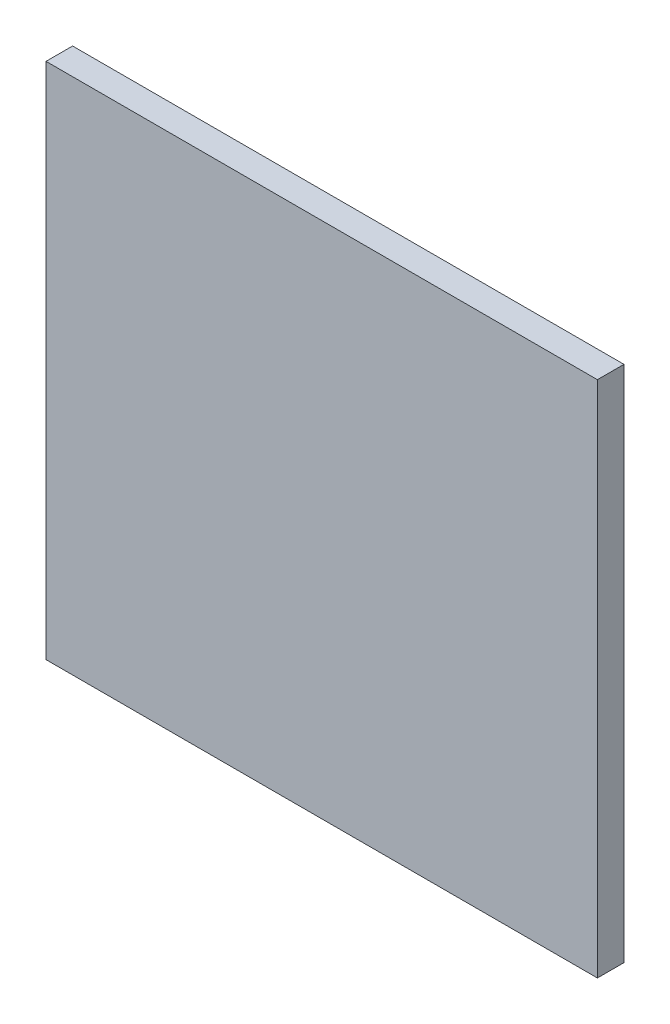
ISO-10303-21;
HEADER;
FILE_DESCRIPTION(('STEP AP214'),'2;1');
FILE_NAME('part.step','',(''),(''),'','','');
FILE_SCHEMA(('AUTOMOTIVE_DESIGN { 1 0 10303 214 1 1 1 1 }'));
ENDSEC;
DATA;
#1=APPLICATION_CONTEXT('core data for automotive mechanical design processes');
#2=APPLICATION_PROTOCOL_DEFINITION('international standard','automotive_design',2000,#1);
#3=PRODUCT_CONTEXT('',#1,'mechanical');
#4=PRODUCT('Part','Part','',(#3));
#5=PRODUCT_RELATED_PRODUCT_CATEGORY('part','',(#4));
#6=PRODUCT_DEFINITION_FORMATION('','',#4);
#7=PRODUCT_DEFINITION_CONTEXT('part definition',#1,'design');
#8=PRODUCT_DEFINITION('design','',#6,#7);
#9=PRODUCT_DEFINITION_SHAPE('','',#8);
#10=(LENGTH_UNIT() NAMED_UNIT(*) SI_UNIT(.MILLI.,.METRE.));
#11=(NAMED_UNIT(*) PLANE_ANGLE_UNIT() SI_UNIT($,.RADIAN.));
#12=(NAMED_UNIT(*) SI_UNIT($,.STERADIAN.) SOLID_ANGLE_UNIT());
#13=UNCERTAINTY_MEASURE_WITH_UNIT(LENGTH_MEASURE(1.E-05),#10,'distance_accuracy_value','');
#14=(GEOMETRIC_REPRESENTATION_CONTEXT(3) GLOBAL_UNCERTAINTY_ASSIGNED_CONTEXT((#13)) GLOBAL_UNIT_ASSIGNED_CONTEXT((#10,
#11,#12)) REPRESENTATION_CONTEXT('',''));
#15=CARTESIAN_POINT('',(0.,0.,0.));
#16=DIRECTION('',(0.,0.,1.));
#17=DIRECTION('',(1.,0.,0.));
#18=AXIS2_PLACEMENT_3D('',#15,#16,#17);
#19=CARTESIAN_POINT('',(0.,0.,2.));
#20=DIRECTION('',(1.,0.,0.));
#21=DIRECTION('',(0.,0.,-1.));
#22=AXIS2_PLACEMENT_3D('',#19,#20,#21);
#23=PLANE('',#22);
#24=DIRECTION('',(0.,-1.,0.));
#25=VECTOR('',#24,1.);
#26=CARTESIAN_POINT('',(0.,0.,0.));
#27=LINE('',#26,#25);
#28=CARTESIAN_POINT('',(0.,39.,0.));
#29=VERTEX_POINT('',#28);
#30=CARTESIAN_POINT('',(0.,0.,0.));
#31=VERTEX_POINT('',#30);
#32=EDGE_CURVE('E96',#29,#31,#27,.T.);
#33=ORIENTED_EDGE('',*,*,#32,.T.);
#34=DIRECTION('',(0.,0.,-1.));
#35=VECTOR('',#34,1.);
#36=CARTESIAN_POINT('',(0.,0.,2.));
#37=LINE('',#36,#35);
#38=CARTESIAN_POINT('',(0.,0.,2.));
#39=VERTEX_POINT('',#38);
#40=EDGE_CURVE('E11',#39,#31,#37,.T.);
#41=ORIENTED_EDGE('',*,*,#40,.F.);
#42=DIRECTION('',(0.,-1.,0.));
#43=VECTOR('',#42,1.);
#44=CARTESIAN_POINT('',(0.,0.,2.));
#45=LINE('',#44,#43);
#46=CARTESIAN_POINT('',(0.,39.,2.));
#47=VERTEX_POINT('',#46);
#48=EDGE_CURVE('E84',#47,#39,#45,.T.);
#49=ORIENTED_EDGE('',*,*,#48,.F.);
#50=DIRECTION('',(0.,0.,-1.));
#51=VECTOR('',#50,1.);
#52=CARTESIAN_POINT('',(0.,39.,2.));
#53=LINE('',#52,#51);
#54=EDGE_CURVE('E92',#47,#29,#53,.T.);
#55=ORIENTED_EDGE('',*,*,#54,.T.);
#56=EDGE_LOOP('',(#33,#41,#49,#55));
#57=FACE_BOUND('',#56,.T.);
#58=ADVANCED_FACE('F33',(#57),#23,.F.);
#59=CARTESIAN_POINT('',(0.,0.,2.));
#60=DIRECTION('',(0.,1.,0.));
#61=DIRECTION('',(0.,0.,1.));
#62=AXIS2_PLACEMENT_3D('',#59,#60,#61);
#63=PLANE('',#62);
#64=DIRECTION('',(1.,0.,0.));
#65=VECTOR('',#64,1.);
#66=CARTESIAN_POINT('',(0.,0.,0.));
#67=LINE('',#66,#65);
#68=CARTESIAN_POINT('',(41.5,0.,0.));
#69=VERTEX_POINT('',#68);
#70=EDGE_CURVE('E88',#31,#69,#67,.T.);
#71=ORIENTED_EDGE('',*,*,#70,.T.);
#72=DIRECTION('',(0.,0.,-1.));
#73=VECTOR('',#72,1.);
#74=CARTESIAN_POINT('',(41.5,0.,2.));
#75=LINE('',#74,#73);
#76=CARTESIAN_POINT('',(41.5,0.,2.));
#77=VERTEX_POINT('',#76);
#78=EDGE_CURVE('E41',#77,#69,#75,.T.);
#79=ORIENTED_EDGE('',*,*,#78,.F.);
#80=DIRECTION('',(1.,0.,0.));
#81=VECTOR('',#80,1.);
#82=CARTESIAN_POINT('',(0.,0.,2.));
#83=LINE('',#82,#81);
#84=EDGE_CURVE('E79',#39,#77,#83,.T.);
#85=ORIENTED_EDGE('',*,*,#84,.F.);
#86=ORIENTED_EDGE('',*,*,#40,.T.);
#87=EDGE_LOOP('',(#71,#79,#85,#86));
#88=FACE_BOUND('',#87,.T.);
#89=ADVANCED_FACE('F87',(#88),#63,.F.);
#90=CARTESIAN_POINT('',(41.5,0.,2.));
#91=DIRECTION('',(-1.,0.,0.));
#92=DIRECTION('',(0.,0.,1.));
#93=AXIS2_PLACEMENT_3D('',#90,#91,#92);
#94=PLANE('',#93);
#95=DIRECTION('',(0.,1.,0.));
#96=VECTOR('',#95,1.);
#97=CARTESIAN_POINT('',(41.5,0.,0.));
#98=LINE('',#97,#96);
#99=CARTESIAN_POINT('',(41.5,39.,0.));
#100=VERTEX_POINT('',#99);
#101=EDGE_CURVE('E66',#69,#100,#98,.T.);
#102=ORIENTED_EDGE('',*,*,#101,.T.);
#103=DIRECTION('',(0.,0.,-1.));
#104=VECTOR('',#103,1.);
#105=CARTESIAN_POINT('',(41.5,39.,2.));
#106=LINE('',#105,#104);
#107=CARTESIAN_POINT('',(41.5,39.,2.));
#108=VERTEX_POINT('',#107);
#109=EDGE_CURVE('E89',#108,#100,#106,.T.);
#110=ORIENTED_EDGE('',*,*,#109,.F.);
#111=DIRECTION('',(0.,1.,0.));
#112=VECTOR('',#111,1.);
#113=CARTESIAN_POINT('',(41.5,0.,2.));
#114=LINE('',#113,#112);
#115=EDGE_CURVE('E82',#77,#108,#114,.T.);
#116=ORIENTED_EDGE('',*,*,#115,.F.);
#117=ORIENTED_EDGE('',*,*,#78,.T.);
#118=EDGE_LOOP('',(#102,#110,#116,#117));
#119=FACE_BOUND('',#118,.T.);
#120=ADVANCED_FACE('F90',(#119),#94,.F.);
#121=CARTESIAN_POINT('',(0.,39.,2.));
#122=DIRECTION('',(0.,-1.,0.));
#123=DIRECTION('',(0.,0.,-1.));
#124=AXIS2_PLACEMENT_3D('',#121,#122,#123);
#125=PLANE('',#124);
#126=DIRECTION('',(-1.,0.,0.));
#127=VECTOR('',#126,1.);
#128=CARTESIAN_POINT('',(0.,39.,0.));
#129=LINE('',#128,#127);
#130=EDGE_CURVE('E72',#100,#29,#129,.T.);
#131=ORIENTED_EDGE('',*,*,#130,.T.);
#132=ORIENTED_EDGE('',*,*,#54,.F.);
#133=DIRECTION('',(-1.,0.,0.));
#134=VECTOR('',#133,1.);
#135=CARTESIAN_POINT('',(0.,39.,2.));
#136=LINE('',#135,#134);
#137=EDGE_CURVE('E49',#108,#47,#136,.T.);
#138=ORIENTED_EDGE('',*,*,#137,.F.);
#139=ORIENTED_EDGE('',*,*,#109,.T.);
#140=EDGE_LOOP('',(#131,#132,#138,#139));
#141=FACE_BOUND('',#140,.T.);
#142=ADVANCED_FACE('F103',(#141),#125,.F.);
#143=CARTESIAN_POINT('',(0.,0.,2.));
#144=DIRECTION('',(0.,0.,-1.));
#145=DIRECTION('',(-1.,0.,0.));
#146=AXIS2_PLACEMENT_3D('',#143,#144,#145);
#147=PLANE('',#146);
#148=ORIENTED_EDGE('',*,*,#48,.T.);
#149=ORIENTED_EDGE('',*,*,#84,.T.);
#150=ORIENTED_EDGE('',*,*,#115,.T.);
#151=ORIENTED_EDGE('',*,*,#137,.T.);
#152=EDGE_LOOP('',(#148,#149,#150,#151));
#153=FACE_BOUND('',#152,.T.);
#154=ADVANCED_FACE('F80',(#153),#147,.F.);
#155=CARTESIAN_POINT('',(0.,0.,0.));
#156=DIRECTION('',(0.,0.,-1.));
#157=DIRECTION('',(-1.,0.,0.));
#158=AXIS2_PLACEMENT_3D('',#155,#156,#157);
#159=PLANE('',#158);
#160=ORIENTED_EDGE('',*,*,#32,.F.);
#161=ORIENTED_EDGE('',*,*,#130,.F.);
#162=ORIENTED_EDGE('',*,*,#101,.F.);
#163=ORIENTED_EDGE('',*,*,#70,.F.);
#164=EDGE_LOOP('',(#160,#161,#162,#163));
#165=FACE_BOUND('',#164,.T.);
#166=ADVANCED_FACE('F106',(#165),#159,.T.);
#167=CLOSED_SHELL('',(#58,#89,#120,#142,#154,#166));
#168=MANIFOLD_SOLID_BREP('B2',#167);
#169=ADVANCED_BREP_SHAPE_REPRESENTATION('',(#18,#168),#14);
#170=SHAPE_DEFINITION_REPRESENTATION(#9,#169);
ENDSEC;
END-ISO-10303-21;
